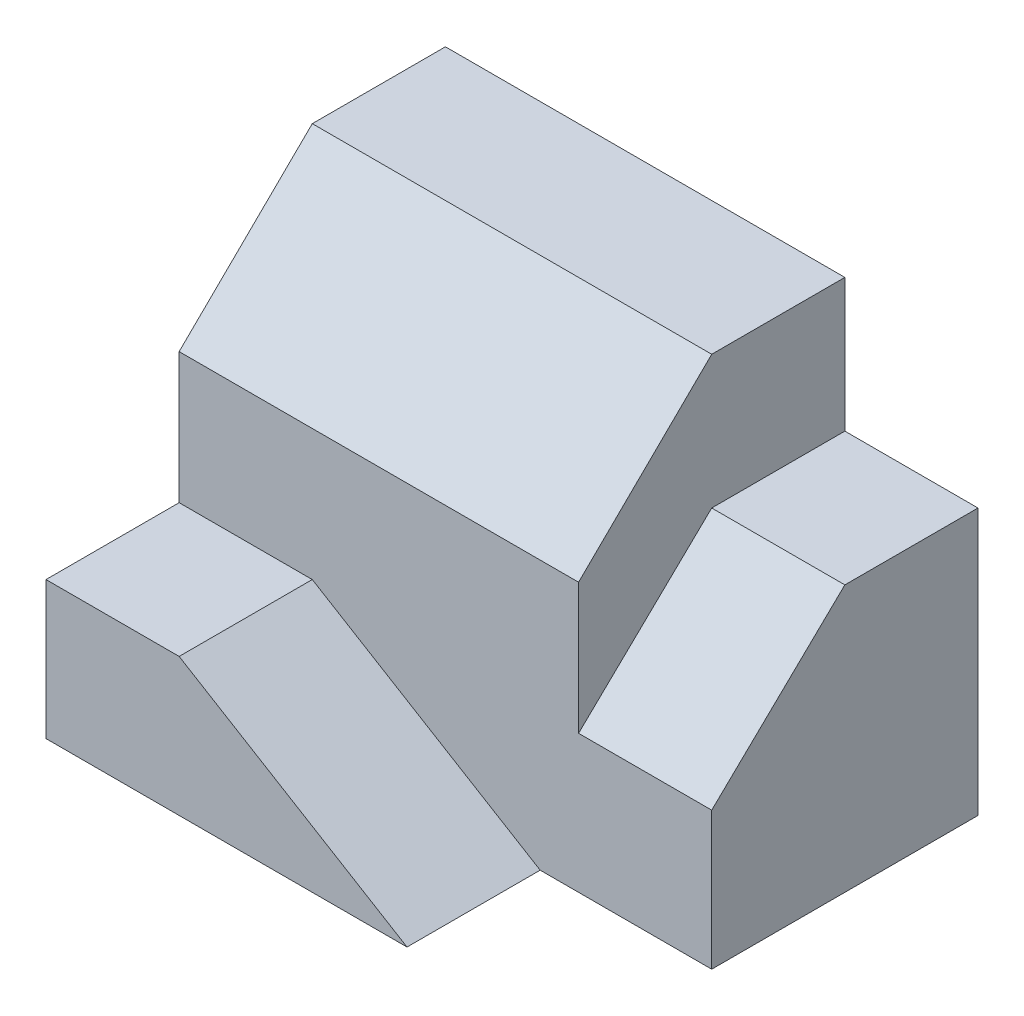
ISO-10303-21;
HEADER;
FILE_DESCRIPTION(('STEP AP214'),'2;1');
FILE_NAME('part.step','',(''),(''),'','','');
FILE_SCHEMA(('AUTOMOTIVE_DESIGN { 1 0 10303 214 1 1 1 1 }'));
ENDSEC;
DATA;
#1=APPLICATION_CONTEXT('core data for automotive mechanical design processes');
#2=APPLICATION_PROTOCOL_DEFINITION('international standard','automotive_design',2000,#1);
#3=PRODUCT_CONTEXT('',#1,'mechanical');
#4=PRODUCT('Part','Part','',(#3));
#5=PRODUCT_RELATED_PRODUCT_CATEGORY('part','',(#4));
#6=PRODUCT_DEFINITION_FORMATION('','',#4);
#7=PRODUCT_DEFINITION_CONTEXT('part definition',#1,'design');
#8=PRODUCT_DEFINITION('design','',#6,#7);
#9=PRODUCT_DEFINITION_SHAPE('','',#8);
#10=(LENGTH_UNIT() NAMED_UNIT(*) SI_UNIT(.MILLI.,.METRE.));
#11=(NAMED_UNIT(*) PLANE_ANGLE_UNIT() SI_UNIT($,.RADIAN.));
#12=(NAMED_UNIT(*) SI_UNIT($,.STERADIAN.) SOLID_ANGLE_UNIT());
#13=UNCERTAINTY_MEASURE_WITH_UNIT(LENGTH_MEASURE(1.E-05),#10,'distance_accuracy_value','');
#14=(GEOMETRIC_REPRESENTATION_CONTEXT(3) GLOBAL_UNCERTAINTY_ASSIGNED_CONTEXT((#13)) GLOBAL_UNIT_ASSIGNED_CONTEXT((#10,
#11,#12)) REPRESENTATION_CONTEXT('',''));
#15=CARTESIAN_POINT('',(0.,0.,0.));
#16=DIRECTION('',(0.,0.,1.));
#17=DIRECTION('',(1.,0.,0.));
#18=AXIS2_PLACEMENT_3D('',#15,#16,#17);
#19=CARTESIAN_POINT('',(50.8,-38.1,38.1));
#20=DIRECTION('',(-1.,0.,0.));
#21=DIRECTION('',(0.,0.,1.));
#22=AXIS2_PLACEMENT_3D('',#19,#20,#21);
#23=PLANE('',#22);
#24=DIRECTION('',(0.,0.,1.));
#25=VECTOR('',#24,1.);
#26=CARTESIAN_POINT('',(50.8,12.7,-38.1));
#27=LINE('',#26,#25);
#28=CARTESIAN_POINT('',(50.8,12.7,-38.1));
#29=VERTEX_POINT('',#28);
#30=CARTESIAN_POINT('',(50.8,12.7,-12.7));
#31=VERTEX_POINT('',#30);
#32=EDGE_CURVE('E239',#29,#31,#27,.T.);
#33=ORIENTED_EDGE('',*,*,#32,.T.);
#34=DIRECTION('',(0.,0.694542249942427,-0.719451918508049));
#35=VECTOR('',#34,1.);
#36=CARTESIAN_POINT('',(50.8,-11.8205728064791,12.7));
#37=LINE('',#36,#35);
#38=CARTESIAN_POINT('',(50.8,-11.8205728064791,12.7));
#39=VERTEX_POINT('',#38);
#40=EDGE_CURVE('E69',#39,#31,#37,.T.);
#41=ORIENTED_EDGE('',*,*,#40,.F.);
#42=DIRECTION('',(0.,1.,0.));
#43=VECTOR('',#42,1.);
#44=CARTESIAN_POINT('',(50.8,-38.1,12.7));
#45=LINE('',#44,#43);
#46=CARTESIAN_POINT('',(50.8,-38.1,12.7));
#47=VERTEX_POINT('',#46);
#48=EDGE_CURVE('E152',#47,#39,#45,.T.);
#49=ORIENTED_EDGE('',*,*,#48,.F.);
#50=DIRECTION('',(0.,0.,-1.));
#51=VECTOR('',#50,1.);
#52=CARTESIAN_POINT('',(50.8,-38.1,38.1));
#53=LINE('',#52,#51);
#54=CARTESIAN_POINT('',(50.8,-38.1,-38.1));
#55=VERTEX_POINT('',#54);
#56=EDGE_CURVE('E170',#47,#55,#53,.T.);
#57=ORIENTED_EDGE('',*,*,#56,.T.);
#58=DIRECTION('',(0.,1.,0.));
#59=VECTOR('',#58,1.);
#60=CARTESIAN_POINT('',(50.8,-38.1,-38.1));
#61=LINE('',#60,#59);
#62=EDGE_CURVE('E151',#55,#29,#61,.T.);
#63=ORIENTED_EDGE('',*,*,#62,.T.);
#64=EDGE_LOOP('',(#33,#41,#49,#57,#63));
#65=FACE_BOUND('',#64,.T.);
#66=ADVANCED_FACE('F46',(#65),#23,.F.);
#67=CARTESIAN_POINT('',(-50.8,38.1,38.1));
#68=DIRECTION('',(0.,-1.,0.));
#69=DIRECTION('',(0.,0.,-1.));
#70=AXIS2_PLACEMENT_3D('',#67,#68,#69);
#71=PLANE('',#70);
#72=DIRECTION('',(0.,0.,-1.));
#73=VECTOR('',#72,1.);
#74=CARTESIAN_POINT('',(-50.8,38.1,38.1));
#75=LINE('',#74,#73);
#76=CARTESIAN_POINT('',(-50.8,38.1,-12.7));
#77=VERTEX_POINT('',#76);
#78=CARTESIAN_POINT('',(-50.8,38.1,-38.1));
#79=VERTEX_POINT('',#78);
#80=EDGE_CURVE('E54',#77,#79,#75,.T.);
#81=ORIENTED_EDGE('',*,*,#80,.F.);
#82=DIRECTION('',(1.,0.,0.));
#83=VECTOR('',#82,1.);
#84=CARTESIAN_POINT('',(-50.8,38.1,-12.7));
#85=LINE('',#84,#83);
#86=CARTESIAN_POINT('',(25.4,38.1,-12.7));
#87=VERTEX_POINT('',#86);
#88=EDGE_CURVE('E129',#77,#87,#85,.T.);
#89=ORIENTED_EDGE('',*,*,#88,.T.);
#90=DIRECTION('',(0.,0.,1.));
#91=VECTOR('',#90,1.);
#92=CARTESIAN_POINT('',(25.4,38.1,-38.1));
#93=LINE('',#92,#91);
#94=CARTESIAN_POINT('',(25.4,38.1,-38.1));
#95=VERTEX_POINT('',#94);
#96=EDGE_CURVE('E195',#95,#87,#93,.T.);
#97=ORIENTED_EDGE('',*,*,#96,.F.);
#98=DIRECTION('',(-1.,0.,0.));
#99=VECTOR('',#98,1.);
#100=CARTESIAN_POINT('',(-50.8,38.1,-38.1));
#101=LINE('',#100,#99);
#102=EDGE_CURVE('E157',#95,#79,#101,.T.);
#103=ORIENTED_EDGE('',*,*,#102,.T.);
#104=EDGE_LOOP('',(#81,#89,#97,#103));
#105=FACE_BOUND('',#104,.T.);
#106=ADVANCED_FACE('F193',(#105),#71,.F.);
#107=CARTESIAN_POINT('',(-50.8,-38.1,38.1));
#108=DIRECTION('',(0.,1.,0.));
#109=DIRECTION('',(0.,0.,1.));
#110=AXIS2_PLACEMENT_3D('',#107,#108,#109);
#111=PLANE('',#110);
#112=DIRECTION('',(0.,0.,-1.));
#113=VECTOR('',#112,1.);
#114=CARTESIAN_POINT('',(-50.8,-38.1,38.1));
#115=LINE('',#114,#113);
#116=CARTESIAN_POINT('',(-50.8,-38.1,38.1));
#117=VERTEX_POINT('',#116);
#118=CARTESIAN_POINT('',(-50.8,-38.1,-38.1));
#119=VERTEX_POINT('',#118);
#120=EDGE_CURVE('E184',#117,#119,#115,.T.);
#121=ORIENTED_EDGE('',*,*,#120,.T.);
#122=DIRECTION('',(1.,0.,0.));
#123=VECTOR('',#122,1.);
#124=CARTESIAN_POINT('',(-50.8,-38.1,-38.1));
#125=LINE('',#124,#123);
#126=EDGE_CURVE('E167',#119,#55,#125,.T.);
#127=ORIENTED_EDGE('',*,*,#126,.T.);
#128=ORIENTED_EDGE('',*,*,#56,.F.);
#129=DIRECTION('',(1.,0.,0.));
#130=VECTOR('',#129,1.);
#131=CARTESIAN_POINT('',(-50.8,-38.1,12.7));
#132=LINE('',#131,#130);
#133=CARTESIAN_POINT('',(18.0744948950581,-38.1,12.7));
#134=VERTEX_POINT('',#133);
#135=EDGE_CURVE('E12',#134,#47,#132,.T.);
#136=ORIENTED_EDGE('',*,*,#135,.F.);
#137=DIRECTION('',(0.,0.,1.));
#138=VECTOR('',#137,1.);
#139=CARTESIAN_POINT('',(18.0744948950581,-38.1,12.7));
#140=LINE('',#139,#138);
#141=CARTESIAN_POINT('',(18.0744948950581,-38.1,38.1));
#142=VERTEX_POINT('',#141);
#143=EDGE_CURVE('E230',#134,#142,#140,.T.);
#144=ORIENTED_EDGE('',*,*,#143,.T.);
#145=DIRECTION('',(1.,0.,0.));
#146=VECTOR('',#145,1.);
#147=CARTESIAN_POINT('',(-50.8,-38.1,38.1));
#148=LINE('',#147,#146);
#149=EDGE_CURVE('E166',#117,#142,#148,.T.);
#150=ORIENTED_EDGE('',*,*,#149,.F.);
#151=EDGE_LOOP('',(#121,#127,#128,#136,#144,#150));
#152=FACE_BOUND('',#151,.T.);
#153=ADVANCED_FACE('F203',(#152),#111,.F.);
#154=CARTESIAN_POINT('',(0.,0.,38.1));
#155=DIRECTION('',(0.,0.,-1.));
#156=DIRECTION('',(-1.,0.,0.));
#157=AXIS2_PLACEMENT_3D('',#154,#155,#156);
#158=PLANE('',#157);
#159=DIRECTION('',(-1.,0.,0.));
#160=VECTOR('',#159,1.);
#161=CARTESIAN_POINT('',(-50.8,-11.8205728064791,38.1));
#162=LINE('',#161,#160);
#163=CARTESIAN_POINT('',(-25.4,-11.8205728064791,38.1));
#164=VERTEX_POINT('',#163);
#165=CARTESIAN_POINT('',(-50.8,-11.8205728064791,38.1));
#166=VERTEX_POINT('',#165);
#167=EDGE_CURVE('E211',#164,#166,#162,.T.);
#168=ORIENTED_EDGE('',*,*,#167,.T.);
#169=DIRECTION('',(0.,-1.,0.));
#170=VECTOR('',#169,1.);
#171=CARTESIAN_POINT('',(-50.8,-38.1,38.1));
#172=LINE('',#171,#170);
#173=EDGE_CURVE('E163',#166,#117,#172,.T.);
#174=ORIENTED_EDGE('',*,*,#173,.T.);
#175=ORIENTED_EDGE('',*,*,#149,.T.);
#176=DIRECTION('',(-0.855797143603506,0.517311558927578,0.));
#177=VECTOR('',#176,1.);
#178=CARTESIAN_POINT('',(-25.4,-11.8205728064791,38.1));
#179=LINE('',#178,#177);
#180=EDGE_CURVE('E212',#142,#164,#179,.T.);
#181=ORIENTED_EDGE('',*,*,#180,.T.);
#182=EDGE_LOOP('',(#168,#174,#175,#181));
#183=FACE_BOUND('',#182,.T.);
#184=ADVANCED_FACE('F209',(#183),#158,.F.);
#185=CARTESIAN_POINT('',(-50.8,-38.1,38.1));
#186=DIRECTION('',(1.,0.,0.));
#187=DIRECTION('',(0.,0.,-1.));
#188=AXIS2_PLACEMENT_3D('',#185,#186,#187);
#189=PLANE('',#188);
#190=DIRECTION('',(0.,-1.,0.));
#191=VECTOR('',#190,1.);
#192=CARTESIAN_POINT('',(-50.8,-38.1,12.7));
#193=LINE('',#192,#191);
#194=CARTESIAN_POINT('',(-50.8,13.1397135967605,12.7));
#195=VERTEX_POINT('',#194);
#196=CARTESIAN_POINT('',(-50.8,-11.8205728064791,12.7));
#197=VERTEX_POINT('',#196);
#198=EDGE_CURVE('E140',#195,#197,#193,.T.);
#199=ORIENTED_EDGE('',*,*,#198,.F.);
#200=DIRECTION('',(0.,0.700906063207394,-0.713253594844858));
#201=VECTOR('',#200,1.);
#202=CARTESIAN_POINT('',(-50.8,38.1,-12.7));
#203=LINE('',#202,#201);
#204=EDGE_CURVE('E126',#195,#77,#203,.T.);
#205=ORIENTED_EDGE('',*,*,#204,.T.);
#206=ORIENTED_EDGE('',*,*,#80,.T.);
#207=DIRECTION('',(0.,-1.,0.));
#208=VECTOR('',#207,1.);
#209=CARTESIAN_POINT('',(-50.8,-38.1,-38.1));
#210=LINE('',#209,#208);
#211=EDGE_CURVE('E175',#79,#119,#210,.T.);
#212=ORIENTED_EDGE('',*,*,#211,.T.);
#213=ORIENTED_EDGE('',*,*,#120,.F.);
#214=ORIENTED_EDGE('',*,*,#173,.F.);
#215=DIRECTION('',(0.,0.,1.));
#216=VECTOR('',#215,1.);
#217=CARTESIAN_POINT('',(-50.8,-11.8205728064791,12.7));
#218=LINE('',#217,#216);
#219=EDGE_CURVE('E149',#197,#166,#218,.T.);
#220=ORIENTED_EDGE('',*,*,#219,.F.);
#221=EDGE_LOOP('',(#199,#205,#206,#212,#213,#214,#220));
#222=FACE_BOUND('',#221,.T.);
#223=ADVANCED_FACE('F147',(#222),#189,.F.);
#224=CARTESIAN_POINT('',(0.,0.,-38.1));
#225=DIRECTION('',(0.,0.,-1.));
#226=DIRECTION('',(-1.,0.,0.));
#227=AXIS2_PLACEMENT_3D('',#224,#225,#226);
#228=PLANE('',#227);
#229=DIRECTION('',(0.,-1.,0.));
#230=VECTOR('',#229,1.);
#231=CARTESIAN_POINT('',(25.4,38.1,-38.1));
#232=LINE('',#231,#230);
#233=CARTESIAN_POINT('',(25.4,12.7,-38.1));
#234=VERTEX_POINT('',#233);
#235=EDGE_CURVE('E248',#95,#234,#232,.T.);
#236=ORIENTED_EDGE('',*,*,#235,.T.);
#237=DIRECTION('',(1.,0.,0.));
#238=VECTOR('',#237,1.);
#239=CARTESIAN_POINT('',(25.4,12.7,-38.1));
#240=LINE('',#239,#238);
#241=EDGE_CURVE('E240',#234,#29,#240,.T.);
#242=ORIENTED_EDGE('',*,*,#241,.T.);
#243=ORIENTED_EDGE('',*,*,#62,.F.);
#244=ORIENTED_EDGE('',*,*,#126,.F.);
#245=ORIENTED_EDGE('',*,*,#211,.F.);
#246=ORIENTED_EDGE('',*,*,#102,.F.);
#247=EDGE_LOOP('',(#236,#242,#243,#244,#245,#246));
#248=FACE_BOUND('',#247,.T.);
#249=ADVANCED_FACE('F198',(#248),#228,.T.);
#250=CARTESIAN_POINT('',(0.,0.,12.7));
#251=DIRECTION('',(0.,0.,1.));
#252=DIRECTION('',(1.,0.,0.));
#253=AXIS2_PLACEMENT_3D('',#250,#251,#252);
#254=PLANE('',#253);
#255=DIRECTION('',(1.,0.,0.));
#256=VECTOR('',#255,1.);
#257=CARTESIAN_POINT('',(-50.8,13.1397135967605,12.7));
#258=LINE('',#257,#256);
#259=CARTESIAN_POINT('',(25.4,13.1397135967605,12.7));
#260=VERTEX_POINT('',#259);
#261=EDGE_CURVE('E61',#195,#260,#258,.T.);
#262=ORIENTED_EDGE('',*,*,#261,.F.);
#263=ORIENTED_EDGE('',*,*,#198,.T.);
#264=DIRECTION('',(-1.,0.,0.));
#265=VECTOR('',#264,1.);
#266=CARTESIAN_POINT('',(-50.8,-11.8205728064791,12.7));
#267=LINE('',#266,#265);
#268=CARTESIAN_POINT('',(-25.4,-11.8205728064791,12.7));
#269=VERTEX_POINT('',#268);
#270=EDGE_CURVE('E221',#269,#197,#267,.T.);
#271=ORIENTED_EDGE('',*,*,#270,.F.);
#272=DIRECTION('',(-0.855797143603506,0.517311558927578,0.));
#273=VECTOR('',#272,1.);
#274=CARTESIAN_POINT('',(-25.4,-11.8205728064791,12.7));
#275=LINE('',#274,#273);
#276=EDGE_CURVE('E216',#134,#269,#275,.T.);
#277=ORIENTED_EDGE('',*,*,#276,.F.);
#278=ORIENTED_EDGE('',*,*,#135,.T.);
#279=ORIENTED_EDGE('',*,*,#48,.T.);
#280=DIRECTION('',(1.,0.,0.));
#281=VECTOR('',#280,1.);
#282=CARTESIAN_POINT('',(-9.90465253699345,-11.8205728064791,12.7));
#283=LINE('',#282,#281);
#284=CARTESIAN_POINT('',(25.4,-11.8205728064791,12.7));
#285=VERTEX_POINT('',#284);
#286=EDGE_CURVE('E249',#285,#39,#283,.T.);
#287=ORIENTED_EDGE('',*,*,#286,.F.);
#288=DIRECTION('',(0.,-1.,0.));
#289=VECTOR('',#288,1.);
#290=CARTESIAN_POINT('',(25.4,38.1,12.7));
#291=LINE('',#290,#289);
#292=EDGE_CURVE('E143',#260,#285,#291,.T.);
#293=ORIENTED_EDGE('',*,*,#292,.F.);
#294=EDGE_LOOP('',(#262,#263,#271,#277,#278,#279,#287,#293));
#295=FACE_BOUND('',#294,.T.);
#296=ADVANCED_FACE('F138',(#295),#254,.T.);
#297=CARTESIAN_POINT('',(-50.8,-11.8205728064791,12.7));
#298=DIRECTION('',(0.,1.,0.));
#299=DIRECTION('',(0.,0.,1.));
#300=AXIS2_PLACEMENT_3D('',#297,#298,#299);
#301=PLANE('',#300);
#302=ORIENTED_EDGE('',*,*,#167,.F.);
#303=DIRECTION('',(0.,0.,1.));
#304=VECTOR('',#303,1.);
#305=CARTESIAN_POINT('',(-25.4,-11.8205728064791,12.7));
#306=LINE('',#305,#304);
#307=EDGE_CURVE('E228',#269,#164,#306,.T.);
#308=ORIENTED_EDGE('',*,*,#307,.F.);
#309=ORIENTED_EDGE('',*,*,#270,.T.);
#310=ORIENTED_EDGE('',*,*,#219,.T.);
#311=EDGE_LOOP('',(#302,#308,#309,#310));
#312=FACE_BOUND('',#311,.T.);
#313=ADVANCED_FACE('F276',(#312),#301,.T.);
#314=CARTESIAN_POINT('',(-25.4,-11.8205728064791,12.7));
#315=DIRECTION('',(0.517311558927578,0.855797143603506,0.));
#316=DIRECTION('',(-0.855797143603506,0.517311558927578,0.));
#317=AXIS2_PLACEMENT_3D('',#314,#315,#316);
#318=PLANE('',#317);
#319=ORIENTED_EDGE('',*,*,#180,.F.);
#320=ORIENTED_EDGE('',*,*,#143,.F.);
#321=ORIENTED_EDGE('',*,*,#276,.T.);
#322=ORIENTED_EDGE('',*,*,#307,.T.);
#323=EDGE_LOOP('',(#319,#320,#321,#322));
#324=FACE_BOUND('',#323,.T.);
#325=ADVANCED_FACE('F275',(#324),#318,.T.);
#326=CARTESIAN_POINT('',(25.4,38.1,-38.1));
#327=DIRECTION('',(-1.,0.,0.));
#328=DIRECTION('',(0.,-1.,0.));
#329=AXIS2_PLACEMENT_3D('',#326,#327,#328);
#330=PLANE('',#329);
#331=ORIENTED_EDGE('',*,*,#96,.T.);
#332=DIRECTION('',(0.,0.700906063207394,-0.713253594844858));
#333=VECTOR('',#332,1.);
#334=CARTESIAN_POINT('',(25.4,38.1,-12.7));
#335=LINE('',#334,#333);
#336=EDGE_CURVE('E134',#260,#87,#335,.T.);
#337=ORIENTED_EDGE('',*,*,#336,.F.);
#338=ORIENTED_EDGE('',*,*,#292,.T.);
#339=DIRECTION('',(0.,0.694542249942427,-0.719451918508049));
#340=VECTOR('',#339,1.);
#341=CARTESIAN_POINT('',(25.4,-11.820572806479,12.7));
#342=LINE('',#341,#340);
#343=CARTESIAN_POINT('',(25.4,12.7,-12.7));
#344=VERTEX_POINT('',#343);
#345=EDGE_CURVE('E259',#285,#344,#342,.T.);
#346=ORIENTED_EDGE('',*,*,#345,.T.);
#347=DIRECTION('',(0.,0.,1.));
#348=VECTOR('',#347,1.);
#349=CARTESIAN_POINT('',(25.4,12.7,-38.1));
#350=LINE('',#349,#348);
#351=EDGE_CURVE('E235',#234,#344,#350,.T.);
#352=ORIENTED_EDGE('',*,*,#351,.F.);
#353=ORIENTED_EDGE('',*,*,#235,.F.);
#354=EDGE_LOOP('',(#331,#337,#338,#346,#352,#353));
#355=FACE_BOUND('',#354,.T.);
#356=ADVANCED_FACE('F269',(#355),#330,.F.);
#357=CARTESIAN_POINT('',(25.4,12.7,-38.1));
#358=DIRECTION('',(0.,-1.,0.));
#359=DIRECTION('',(0.,0.,-1.));
#360=AXIS2_PLACEMENT_3D('',#357,#358,#359);
#361=PLANE('',#360);
#362=ORIENTED_EDGE('',*,*,#351,.T.);
#363=DIRECTION('',(1.,0.,0.));
#364=VECTOR('',#363,1.);
#365=CARTESIAN_POINT('',(-9.90465253699345,12.7,-12.7));
#366=LINE('',#365,#364);
#367=EDGE_CURVE('E256',#344,#31,#366,.T.);
#368=ORIENTED_EDGE('',*,*,#367,.T.);
#369=ORIENTED_EDGE('',*,*,#32,.F.);
#370=ORIENTED_EDGE('',*,*,#241,.F.);
#371=EDGE_LOOP('',(#362,#368,#369,#370));
#372=FACE_BOUND('',#371,.T.);
#373=ADVANCED_FACE('F340',(#372),#361,.F.);
#374=CARTESIAN_POINT('',(-9.90465253699345,-11.8205728064791,12.7));
#375=DIRECTION('',(0.,-0.719451918508049,-0.694542249942427));
#376=DIRECTION('',(0.,0.694542249942427,-0.719451918508049));
#377=AXIS2_PLACEMENT_3D('',#374,#375,#376);
#378=PLANE('',#377);
#379=ORIENTED_EDGE('',*,*,#286,.T.);
#380=ORIENTED_EDGE('',*,*,#40,.T.);
#381=ORIENTED_EDGE('',*,*,#367,.F.);
#382=ORIENTED_EDGE('',*,*,#345,.F.);
#383=EDGE_LOOP('',(#379,#380,#381,#382));
#384=FACE_BOUND('',#383,.T.);
#385=ADVANCED_FACE('F347',(#384),#378,.F.);
#386=CARTESIAN_POINT('',(-50.8,38.1,-12.7));
#387=DIRECTION('',(0.,-0.713253594844858,-0.700906063207394));
#388=DIRECTION('',(0.,0.700906063207394,-0.713253594844858));
#389=AXIS2_PLACEMENT_3D('',#386,#387,#388);
#390=PLANE('',#389);
#391=ORIENTED_EDGE('',*,*,#336,.T.);
#392=ORIENTED_EDGE('',*,*,#88,.F.);
#393=ORIENTED_EDGE('',*,*,#204,.F.);
#394=ORIENTED_EDGE('',*,*,#261,.T.);
#395=EDGE_LOOP('',(#391,#392,#393,#394));
#396=FACE_BOUND('',#395,.T.);
#397=ADVANCED_FACE('F127',(#396),#390,.F.);
#398=CLOSED_SHELL('',(#66,#106,#153,#184,#223,#249,#296,#313,#325,#356,#373,#385,#397));
#399=MANIFOLD_SOLID_BREP('B2',#398);
#400=ADVANCED_BREP_SHAPE_REPRESENTATION('',(#18,#399),#14);
#401=SHAPE_DEFINITION_REPRESENTATION(#9,#400);
ENDSEC;
END-ISO-10303-21;
